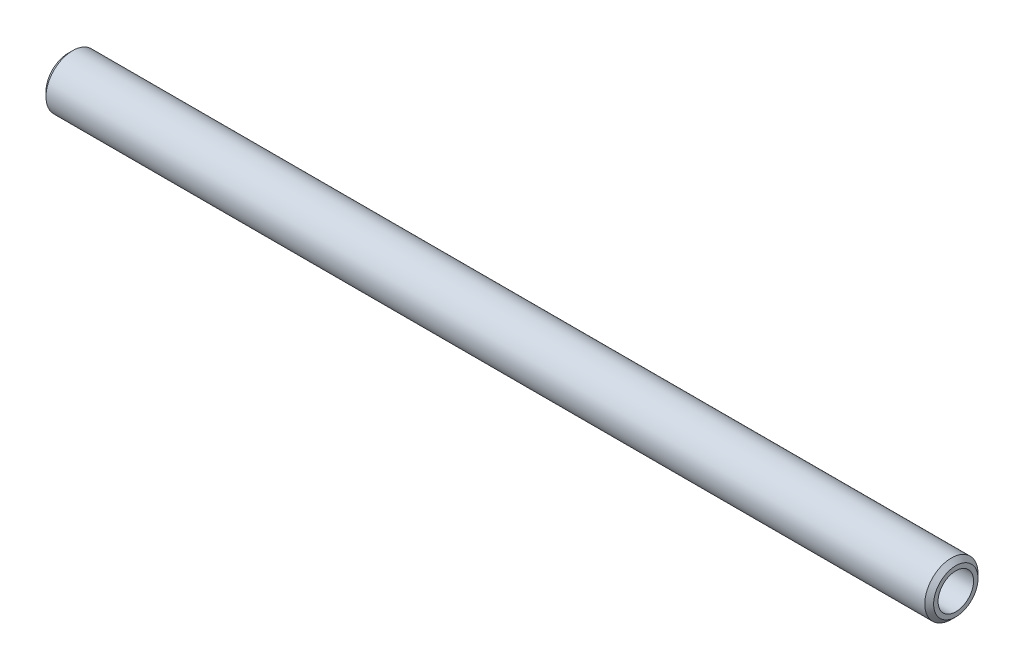
ISO-10303-21;
HEADER;
FILE_DESCRIPTION(('STEP AP214'),'2;1');
FILE_NAME('part.step','',(''),(''),'','','');
FILE_SCHEMA(('AUTOMOTIVE_DESIGN { 1 0 10303 214 1 1 1 1 }'));
ENDSEC;
DATA;
#1=APPLICATION_CONTEXT('core data for automotive mechanical design processes');
#2=APPLICATION_PROTOCOL_DEFINITION('international standard','automotive_design',2000,#1);
#3=PRODUCT_CONTEXT('',#1,'mechanical');
#4=PRODUCT('Part','Part','',(#3));
#5=PRODUCT_RELATED_PRODUCT_CATEGORY('part','',(#4));
#6=PRODUCT_DEFINITION_FORMATION('','',#4);
#7=PRODUCT_DEFINITION_CONTEXT('part definition',#1,'design');
#8=PRODUCT_DEFINITION('design','',#6,#7);
#9=PRODUCT_DEFINITION_SHAPE('','',#8);
#10=(LENGTH_UNIT() NAMED_UNIT(*) SI_UNIT(.MILLI.,.METRE.));
#11=(NAMED_UNIT(*) PLANE_ANGLE_UNIT() SI_UNIT($,.RADIAN.));
#12=(NAMED_UNIT(*) SI_UNIT($,.STERADIAN.) SOLID_ANGLE_UNIT());
#13=UNCERTAINTY_MEASURE_WITH_UNIT(LENGTH_MEASURE(1.E-05),#10,'distance_accuracy_value','');
#14=(GEOMETRIC_REPRESENTATION_CONTEXT(3) GLOBAL_UNCERTAINTY_ASSIGNED_CONTEXT((#13)) GLOBAL_UNIT_ASSIGNED_CONTEXT((#10,
#11,#12)) REPRESENTATION_CONTEXT('',''));
#15=CARTESIAN_POINT('',(0.,0.,0.));
#16=DIRECTION('',(0.,0.,1.));
#17=DIRECTION('',(1.,0.,0.));
#18=AXIS2_PLACEMENT_3D('',#15,#16,#17);
#19=CARTESIAN_POINT('',(50.,0.,0.));
#20=DIRECTION('',(1.,0.,0.));
#21=DIRECTION('',(0.,0.,-1.));
#22=AXIS2_PLACEMENT_3D('',#19,#20,#21);
#23=PLANE('',#22);
#24=CARTESIAN_POINT('',(50.,0.,0.));
#25=DIRECTION('',(1.,0.,0.));
#26=DIRECTION('',(0.,0.,-1.));
#27=AXIS2_PLACEMENT_3D('',#24,#25,#26);
#28=CIRCLE('',#27,2.5);
#29=CARTESIAN_POINT('',(50.,0.,-2.5));
#30=VERTEX_POINT('',#29);
#31=EDGE_CURVE('E10',#30,#30,#28,.T.);
#32=ORIENTED_EDGE('',*,*,#31,.T.);
#33=EDGE_LOOP('',(#32));
#34=FACE_BOUND('',#33,.T.);
#35=CARTESIAN_POINT('',(50.,0.,0.));
#36=DIRECTION('',(1.,0.,0.));
#37=DIRECTION('',(0.,0.,-1.));
#38=AXIS2_PLACEMENT_3D('',#35,#36,#37);
#39=CIRCLE('',#38,2.);
#40=CARTESIAN_POINT('',(50.,0.,-2.));
#41=VERTEX_POINT('',#40);
#42=EDGE_CURVE('E62',#41,#41,#39,.T.);
#43=ORIENTED_EDGE('',*,*,#42,.F.);
#44=EDGE_LOOP('',(#43));
#45=FACE_BOUND('',#44,.T.);
#46=ADVANCED_FACE('F41',(#34,#45),#23,.T.);
#47=CARTESIAN_POINT('',(-50.,0.,0.));
#48=DIRECTION('',(1.,0.,0.));
#49=DIRECTION('',(0.,0.,-1.));
#50=AXIS2_PLACEMENT_3D('',#47,#48,#49);
#51=PLANE('',#50);
#52=CARTESIAN_POINT('',(-50.,0.,0.));
#53=DIRECTION('',(1.,0.,0.));
#54=DIRECTION('',(0.,0.,-1.));
#55=AXIS2_PLACEMENT_3D('',#52,#53,#54);
#56=CIRCLE('',#55,2.50000000000004);
#57=CARTESIAN_POINT('',(-50.,0.,-2.50000000000004));
#58=VERTEX_POINT('',#57);
#59=EDGE_CURVE('E49',#58,#58,#56,.F.);
#60=ORIENTED_EDGE('',*,*,#59,.T.);
#61=EDGE_LOOP('',(#60));
#62=FACE_BOUND('',#61,.T.);
#63=CARTESIAN_POINT('',(-50.,0.,0.));
#64=DIRECTION('',(1.,0.,0.));
#65=DIRECTION('',(0.,0.,-1.));
#66=AXIS2_PLACEMENT_3D('',#63,#64,#65);
#67=CIRCLE('',#66,2.);
#68=CARTESIAN_POINT('',(-50.,0.,-2.));
#69=VERTEX_POINT('',#68);
#70=EDGE_CURVE('E63',#69,#69,#67,.T.);
#71=ORIENTED_EDGE('',*,*,#70,.T.);
#72=EDGE_LOOP('',(#71));
#73=FACE_BOUND('',#72,.T.);
#74=ADVANCED_FACE('F73',(#62,#73),#51,.F.);
#75=CARTESIAN_POINT('',(50.,0.,0.));
#76=DIRECTION('',(-1.,0.,0.));
#77=DIRECTION('',(0.,0.,1.));
#78=AXIS2_PLACEMENT_3D('',#75,#76,#77);
#79=CYLINDRICAL_SURFACE('',#78,3.);
#80=CARTESIAN_POINT('',(-49.5,0.,0.));
#81=DIRECTION('',(1.,0.,0.));
#82=DIRECTION('',(0.,0.,-1.));
#83=AXIS2_PLACEMENT_3D('',#80,#81,#82);
#84=CIRCLE('',#83,3.);
#85=CARTESIAN_POINT('',(-49.5,0.,-3.));
#86=VERTEX_POINT('',#85);
#87=EDGE_CURVE('E53',#86,#86,#84,.T.);
#88=ORIENTED_EDGE('',*,*,#87,.T.);
#89=EDGE_LOOP('',(#88));
#90=FACE_BOUND('',#89,.T.);
#91=CARTESIAN_POINT('',(49.5,0.,0.));
#92=DIRECTION('',(1.,0.,0.));
#93=DIRECTION('',(0.,0.,-1.));
#94=AXIS2_PLACEMENT_3D('',#91,#92,#93);
#95=CIRCLE('',#94,3.);
#96=CARTESIAN_POINT('',(49.5,0.,-3.));
#97=VERTEX_POINT('',#96);
#98=EDGE_CURVE('E57',#97,#97,#95,.F.);
#99=ORIENTED_EDGE('',*,*,#98,.T.);
#100=EDGE_LOOP('',(#99));
#101=FACE_BOUND('',#100,.T.);
#102=ADVANCED_FACE('F78',(#90,#101),#79,.T.);
#103=CARTESIAN_POINT('',(50.,0.,0.));
#104=DIRECTION('',(-1.,0.,0.));
#105=DIRECTION('',(0.,0.,1.));
#106=AXIS2_PLACEMENT_3D('',#103,#104,#105);
#107=CYLINDRICAL_SURFACE('',#106,2.);
#108=ORIENTED_EDGE('',*,*,#42,.T.);
#109=EDGE_LOOP('',(#108));
#110=FACE_BOUND('',#109,.T.);
#111=ORIENTED_EDGE('',*,*,#70,.F.);
#112=EDGE_LOOP('',(#111));
#113=FACE_BOUND('',#112,.T.);
#114=ADVANCED_FACE('F69',(#110,#113),#107,.F.);
#115=CARTESIAN_POINT('',(-49.5,0.,0.));
#116=DIRECTION('',(1.,0.,0.));
#117=DIRECTION('',(0.,0.,-1.));
#118=AXIS2_PLACEMENT_3D('',#115,#116,#117);
#119=CONICAL_SURFACE('',#118,3.,0.785398163397431);
#120=ORIENTED_EDGE('',*,*,#59,.F.);
#121=EDGE_LOOP('',(#120));
#122=FACE_BOUND('',#121,.T.);
#123=ORIENTED_EDGE('',*,*,#87,.F.);
#124=EDGE_LOOP('',(#123));
#125=FACE_BOUND('',#124,.T.);
#126=ADVANCED_FACE('F85',(#122,#125),#119,.T.);
#127=CARTESIAN_POINT('',(50.,0.,0.));
#128=DIRECTION('',(-1.,0.,0.));
#129=DIRECTION('',(0.,0.,1.));
#130=AXIS2_PLACEMENT_3D('',#127,#128,#129);
#131=CONICAL_SURFACE('',#130,2.5,0.785398163397438);
#132=ORIENTED_EDGE('',*,*,#98,.F.);
#133=EDGE_LOOP('',(#132));
#134=FACE_BOUND('',#133,.T.);
#135=ORIENTED_EDGE('',*,*,#31,.F.);
#136=EDGE_LOOP('',(#135));
#137=FACE_BOUND('',#136,.T.);
#138=ADVANCED_FACE('F44',(#134,#137),#131,.T.);
#139=CLOSED_SHELL('',(#46,#74,#102,#114,#126,#138));
#140=MANIFOLD_SOLID_BREP('B2',#139);
#141=ADVANCED_BREP_SHAPE_REPRESENTATION('',(#18,#140),#14);
#142=SHAPE_DEFINITION_REPRESENTATION(#9,#141);
ENDSEC;
END-ISO-10303-21;
